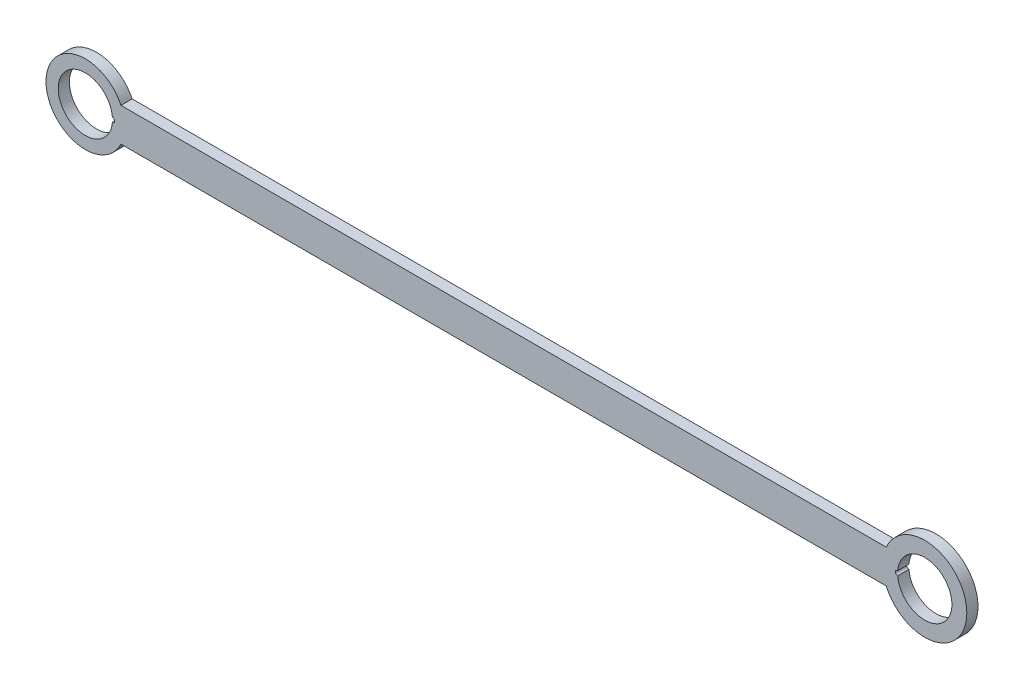
ISO-10303-21;
HEADER;
FILE_DESCRIPTION(('STEP AP214'),'2;1');
FILE_NAME('part.step','',(''),(''),'','','');
FILE_SCHEMA(('AUTOMOTIVE_DESIGN { 1 0 10303 214 1 1 1 1 }'));
ENDSEC;
DATA;
#1=APPLICATION_CONTEXT('core data for automotive mechanical design processes');
#2=APPLICATION_PROTOCOL_DEFINITION('international standard','automotive_design',2000,#1);
#3=PRODUCT_CONTEXT('',#1,'mechanical');
#4=PRODUCT('Part','Part','',(#3));
#5=PRODUCT_RELATED_PRODUCT_CATEGORY('part','',(#4));
#6=PRODUCT_DEFINITION_FORMATION('','',#4);
#7=PRODUCT_DEFINITION_CONTEXT('part definition',#1,'design');
#8=PRODUCT_DEFINITION('design','',#6,#7);
#9=PRODUCT_DEFINITION_SHAPE('','',#8);
#10=(LENGTH_UNIT() NAMED_UNIT(*) SI_UNIT(.MILLI.,.METRE.));
#11=(NAMED_UNIT(*) PLANE_ANGLE_UNIT() SI_UNIT($,.RADIAN.));
#12=(NAMED_UNIT(*) SI_UNIT($,.STERADIAN.) SOLID_ANGLE_UNIT());
#13=UNCERTAINTY_MEASURE_WITH_UNIT(LENGTH_MEASURE(1.E-05),#10,'distance_accuracy_value','');
#14=(GEOMETRIC_REPRESENTATION_CONTEXT(3) GLOBAL_UNCERTAINTY_ASSIGNED_CONTEXT((#13)) GLOBAL_UNIT_ASSIGNED_CONTEXT((#10,
#11,#12)) REPRESENTATION_CONTEXT('',''));
#15=CARTESIAN_POINT('',(0.,0.,0.));
#16=DIRECTION('',(0.,0.,1.));
#17=DIRECTION('',(1.,0.,0.));
#18=AXIS2_PLACEMENT_3D('',#15,#16,#17);
#19=CARTESIAN_POINT('',(0.,0.,4.));
#20=DIRECTION('',(0.,0.,-1.));
#21=DIRECTION('',(-1.,0.,0.));
#22=AXIS2_PLACEMENT_3D('',#19,#20,#21);
#23=PLANE('',#22);
#24=CARTESIAN_POINT('',(0.,0.,4.));
#25=DIRECTION('',(0.,0.,1.));
#26=DIRECTION('',(-1.,0.,0.));
#27=AXIS2_PLACEMENT_3D('',#24,#25,#26);
#28=CIRCLE('',#27,14.0628919691904);
#29=CARTESIAN_POINT('',(12.718684308415,6.,4.));
#30=VERTEX_POINT('',#29);
#31=CARTESIAN_POINT('',(12.718684308415,-6.,4.));
#32=VERTEX_POINT('',#31);
#33=EDGE_CURVE('E137',#30,#32,#28,.T.);
#34=ORIENTED_EDGE('',*,*,#33,.T.);
#35=DIRECTION('',(1.,0.,0.));
#36=VECTOR('',#35,1.);
#37=CARTESIAN_POINT('',(12.718684308415,-6.,4.));
#38=LINE('',#37,#36);
#39=CARTESIAN_POINT('',(286.224480752541,-5.99999999999999,4.));
#40=VERTEX_POINT('',#39);
#41=EDGE_CURVE('E141',#32,#40,#38,.T.);
#42=ORIENTED_EDGE('',*,*,#41,.T.);
#43=CARTESIAN_POINT('',(300.,0.,4.));
#44=DIRECTION('',(0.,0.,1.));
#45=DIRECTION('',(1.,0.,0.));
#46=AXIS2_PLACEMENT_3D('',#43,#44,#45);
#47=CIRCLE('',#46,15.0254760502661);
#48=CARTESIAN_POINT('',(286.224480752541,6.,4.));
#49=VERTEX_POINT('',#48);
#50=EDGE_CURVE('E145',#40,#49,#47,.T.);
#51=ORIENTED_EDGE('',*,*,#50,.T.);
#52=DIRECTION('',(-1.,0.,0.));
#53=VECTOR('',#52,1.);
#54=CARTESIAN_POINT('',(12.718684308415,6.,4.));
#55=LINE('',#54,#53);
#56=EDGE_CURVE('E148',#49,#30,#55,.T.);
#57=ORIENTED_EDGE('',*,*,#56,.T.);
#58=EDGE_LOOP('',(#34,#42,#51,#57));
#59=FACE_BOUND('',#58,.T.);
#60=CARTESIAN_POINT('',(0.,0.,4.));
#61=DIRECTION('',(0.,0.,1.));
#62=DIRECTION('',(1.,0.,0.));
#63=AXIS2_PLACEMENT_3D('',#60,#61,#62);
#64=CIRCLE('',#63,9.7);
#65=CARTESIAN_POINT('',(9.66701030927835,0.799319510775317,4.));
#66=VERTEX_POINT('',#65);
#67=CARTESIAN_POINT('',(9.66701030927835,-0.799319510775317,4.));
#68=VERTEX_POINT('',#67);
#69=EDGE_CURVE('E126',#66,#68,#64,.T.);
#70=ORIENTED_EDGE('',*,*,#69,.F.);
#71=CARTESIAN_POINT('',(9.7,0.,4.));
#72=DIRECTION('',(0.,0.,1.));
#73=DIRECTION('',(1.,0.,0.));
#74=AXIS2_PLACEMENT_3D('',#71,#72,#73);
#75=CIRCLE('',#74,0.800000000000001);
#76=EDGE_CURVE('E54',#68,#66,#75,.T.);
#77=ORIENTED_EDGE('',*,*,#76,.F.);
#78=EDGE_LOOP('',(#70,#77));
#79=FACE_BOUND('',#78,.T.);
#80=CARTESIAN_POINT('',(300.,0.,4.));
#81=DIRECTION('',(0.,0.,1.));
#82=DIRECTION('',(1.,0.,0.));
#83=AXIS2_PLACEMENT_3D('',#80,#81,#82);
#84=CIRCLE('',#83,9.7);
#85=CARTESIAN_POINT('',(290.332989690722,-0.799319510775326,4.));
#86=VERTEX_POINT('',#85);
#87=CARTESIAN_POINT('',(290.332989690722,0.799319510775327,4.));
#88=VERTEX_POINT('',#87);
#89=EDGE_CURVE('E115',#86,#88,#84,.T.);
#90=ORIENTED_EDGE('',*,*,#89,.F.);
#91=CARTESIAN_POINT('',(290.3,0.,4.));
#92=DIRECTION('',(0.,0.,1.));
#93=DIRECTION('',(1.,0.,0.));
#94=AXIS2_PLACEMENT_3D('',#91,#92,#93);
#95=CIRCLE('',#94,0.800000000000011);
#96=EDGE_CURVE('E62',#88,#86,#95,.T.);
#97=ORIENTED_EDGE('',*,*,#96,.F.);
#98=EDGE_LOOP('',(#90,#97));
#99=FACE_BOUND('',#98,.T.);
#100=ADVANCED_FACE('F39',(#59,#79,#99),#23,.F.);
#101=CARTESIAN_POINT('',(0.,0.,0.));
#102=DIRECTION('',(0.,0.,-1.));
#103=DIRECTION('',(-1.,0.,0.));
#104=AXIS2_PLACEMENT_3D('',#101,#102,#103);
#105=PLANE('',#104);
#106=CARTESIAN_POINT('',(9.7,0.,0.));
#107=DIRECTION('',(0.,0.,-1.));
#108=DIRECTION('',(-1.,0.,0.));
#109=AXIS2_PLACEMENT_3D('',#106,#107,#108);
#110=CIRCLE('',#109,0.800000000000001);
#111=CARTESIAN_POINT('',(9.66701030927835,0.799319510775316,0.));
#112=VERTEX_POINT('',#111);
#113=CARTESIAN_POINT('',(9.66701030927835,-0.79931951077531,0.));
#114=VERTEX_POINT('',#113);
#115=EDGE_CURVE('E128',#112,#114,#110,.T.);
#116=ORIENTED_EDGE('',*,*,#115,.F.);
#117=CARTESIAN_POINT('',(0.,0.,0.));
#118=DIRECTION('',(0.,0.,1.));
#119=DIRECTION('',(1.,0.,0.));
#120=AXIS2_PLACEMENT_3D('',#117,#118,#119);
#121=CIRCLE('',#120,9.7);
#122=EDGE_CURVE('E120',#112,#114,#121,.T.);
#123=ORIENTED_EDGE('',*,*,#122,.T.);
#124=EDGE_LOOP('',(#116,#123));
#125=FACE_BOUND('',#124,.T.);
#126=CARTESIAN_POINT('',(290.3,0.,0.));
#127=DIRECTION('',(0.,0.,-1.));
#128=DIRECTION('',(-1.,0.,0.));
#129=AXIS2_PLACEMENT_3D('',#126,#127,#128);
#130=CIRCLE('',#129,0.800000000000011);
#131=CARTESIAN_POINT('',(290.332989690722,-0.799319510775329,0.));
#132=VERTEX_POINT('',#131);
#133=CARTESIAN_POINT('',(290.332989690722,0.799319510775326,0.));
#134=VERTEX_POINT('',#133);
#135=EDGE_CURVE('E105',#132,#134,#130,.T.);
#136=ORIENTED_EDGE('',*,*,#135,.F.);
#137=CARTESIAN_POINT('',(300.,0.,0.));
#138=DIRECTION('',(0.,0.,1.));
#139=DIRECTION('',(1.,0.,0.));
#140=AXIS2_PLACEMENT_3D('',#137,#138,#139);
#141=CIRCLE('',#140,9.7);
#142=EDGE_CURVE('E121',#132,#134,#141,.T.);
#143=ORIENTED_EDGE('',*,*,#142,.T.);
#144=EDGE_LOOP('',(#136,#143));
#145=FACE_BOUND('',#144,.T.);
#146=CARTESIAN_POINT('',(0.,0.,0.));
#147=DIRECTION('',(0.,0.,1.));
#148=DIRECTION('',(-1.,0.,0.));
#149=AXIS2_PLACEMENT_3D('',#146,#147,#148);
#150=CIRCLE('',#149,14.0628919691904);
#151=CARTESIAN_POINT('',(12.718684308415,6.,0.));
#152=VERTEX_POINT('',#151);
#153=CARTESIAN_POINT('',(12.718684308415,-6.,0.));
#154=VERTEX_POINT('',#153);
#155=EDGE_CURVE('E135',#152,#154,#150,.T.);
#156=ORIENTED_EDGE('',*,*,#155,.F.);
#157=DIRECTION('',(-1.,0.,0.));
#158=VECTOR('',#157,1.);
#159=CARTESIAN_POINT('',(12.718684308415,6.,0.));
#160=LINE('',#159,#158);
#161=CARTESIAN_POINT('',(286.224480752541,6.,0.));
#162=VERTEX_POINT('',#161);
#163=EDGE_CURVE('E142',#162,#152,#160,.T.);
#164=ORIENTED_EDGE('',*,*,#163,.F.);
#165=CARTESIAN_POINT('',(300.,0.,0.));
#166=DIRECTION('',(0.,0.,1.));
#167=DIRECTION('',(1.,0.,0.));
#168=AXIS2_PLACEMENT_3D('',#165,#166,#167);
#169=CIRCLE('',#168,15.0254760502661);
#170=CARTESIAN_POINT('',(286.224480752541,-5.99999999999999,0.));
#171=VERTEX_POINT('',#170);
#172=EDGE_CURVE('E158',#171,#162,#169,.T.);
#173=ORIENTED_EDGE('',*,*,#172,.F.);
#174=DIRECTION('',(1.,0.,0.));
#175=VECTOR('',#174,1.);
#176=CARTESIAN_POINT('',(12.718684308415,-6.,0.));
#177=LINE('',#176,#175);
#178=EDGE_CURVE('E155',#154,#171,#177,.T.);
#179=ORIENTED_EDGE('',*,*,#178,.F.);
#180=EDGE_LOOP('',(#156,#164,#173,#179));
#181=FACE_BOUND('',#180,.T.);
#182=ADVANCED_FACE('F187',(#125,#145,#181),#105,.T.);
#183=CARTESIAN_POINT('',(0.,0.,4.));
#184=DIRECTION('',(0.,0.,-1.));
#185=DIRECTION('',(-1.,0.,0.));
#186=AXIS2_PLACEMENT_3D('',#183,#184,#185);
#187=CYLINDRICAL_SURFACE('',#186,14.0628919691904);
#188=ORIENTED_EDGE('',*,*,#155,.T.);
#189=DIRECTION('',(0.,0.,-1.));
#190=VECTOR('',#189,1.);
#191=CARTESIAN_POINT('',(12.718684308415,-6.,4.));
#192=LINE('',#191,#190);
#193=EDGE_CURVE('E174',#32,#154,#192,.T.);
#194=ORIENTED_EDGE('',*,*,#193,.F.);
#195=ORIENTED_EDGE('',*,*,#33,.F.);
#196=DIRECTION('',(0.,0.,-1.));
#197=VECTOR('',#196,1.);
#198=CARTESIAN_POINT('',(12.718684308415,6.,4.));
#199=LINE('',#198,#197);
#200=EDGE_CURVE('E151',#30,#152,#199,.T.);
#201=ORIENTED_EDGE('',*,*,#200,.T.);
#202=EDGE_LOOP('',(#188,#194,#195,#201));
#203=FACE_BOUND('',#202,.T.);
#204=ADVANCED_FACE('F41',(#203),#187,.T.);
#205=CARTESIAN_POINT('',(12.718684308415,-6.,4.));
#206=DIRECTION('',(0.,1.,0.));
#207=DIRECTION('',(0.,0.,1.));
#208=AXIS2_PLACEMENT_3D('',#205,#206,#207);
#209=PLANE('',#208);
#210=ORIENTED_EDGE('',*,*,#178,.T.);
#211=DIRECTION('',(0.,0.,-1.));
#212=VECTOR('',#211,1.);
#213=CARTESIAN_POINT('',(286.224480752541,-5.99999999999999,4.));
#214=LINE('',#213,#212);
#215=EDGE_CURVE('E170',#40,#171,#214,.T.);
#216=ORIENTED_EDGE('',*,*,#215,.F.);
#217=ORIENTED_EDGE('',*,*,#41,.F.);
#218=ORIENTED_EDGE('',*,*,#193,.T.);
#219=EDGE_LOOP('',(#210,#216,#217,#218));
#220=FACE_BOUND('',#219,.T.);
#221=ADVANCED_FACE('F211',(#220),#209,.F.);
#222=CARTESIAN_POINT('',(300.,0.,4.));
#223=DIRECTION('',(0.,0.,-1.));
#224=DIRECTION('',(-1.,0.,0.));
#225=AXIS2_PLACEMENT_3D('',#222,#223,#224);
#226=CYLINDRICAL_SURFACE('',#225,15.0254760502661);
#227=ORIENTED_EDGE('',*,*,#172,.T.);
#228=DIRECTION('',(0.,0.,-1.));
#229=VECTOR('',#228,1.);
#230=CARTESIAN_POINT('',(286.224480752541,6.,4.));
#231=LINE('',#230,#229);
#232=EDGE_CURVE('E166',#49,#162,#231,.T.);
#233=ORIENTED_EDGE('',*,*,#232,.F.);
#234=ORIENTED_EDGE('',*,*,#50,.F.);
#235=ORIENTED_EDGE('',*,*,#215,.T.);
#236=EDGE_LOOP('',(#227,#233,#234,#235));
#237=FACE_BOUND('',#236,.T.);
#238=ADVANCED_FACE('F208',(#237),#226,.T.);
#239=CARTESIAN_POINT('',(12.718684308415,6.,4.));
#240=DIRECTION('',(0.,-1.,0.));
#241=DIRECTION('',(0.,0.,-1.));
#242=AXIS2_PLACEMENT_3D('',#239,#240,#241);
#243=PLANE('',#242);
#244=ORIENTED_EDGE('',*,*,#163,.T.);
#245=ORIENTED_EDGE('',*,*,#200,.F.);
#246=ORIENTED_EDGE('',*,*,#56,.F.);
#247=ORIENTED_EDGE('',*,*,#232,.T.);
#248=EDGE_LOOP('',(#244,#245,#246,#247));
#249=FACE_BOUND('',#248,.T.);
#250=ADVANCED_FACE('F205',(#249),#243,.F.);
#251=CARTESIAN_POINT('',(0.,0.,4.));
#252=DIRECTION('',(0.,0.,-1.));
#253=DIRECTION('',(-1.,0.,0.));
#254=AXIS2_PLACEMENT_3D('',#251,#252,#253);
#255=CYLINDRICAL_SURFACE('',#254,9.7);
#256=DIRECTION('',(0.,0.,1.));
#257=VECTOR('',#256,1.);
#258=CARTESIAN_POINT('',(9.66701030927835,-0.799319510775316,-1.));
#259=LINE('',#258,#257);
#260=EDGE_CURVE('E11',#114,#68,#259,.T.);
#261=ORIENTED_EDGE('',*,*,#260,.F.);
#262=ORIENTED_EDGE('',*,*,#122,.F.);
#263=DIRECTION('',(0.,0.,1.));
#264=VECTOR('',#263,1.);
#265=CARTESIAN_POINT('',(9.66701030927835,0.799319510775316,-1.));
#266=LINE('',#265,#264);
#267=EDGE_CURVE('E48',#66,#112,#266,.F.);
#268=ORIENTED_EDGE('',*,*,#267,.F.);
#269=ORIENTED_EDGE('',*,*,#69,.T.);
#270=EDGE_LOOP('',(#261,#262,#268,#269));
#271=FACE_BOUND('',#270,.T.);
#272=ADVANCED_FACE('F190',(#271),#255,.F.);
#273=CARTESIAN_POINT('',(300.,0.,4.));
#274=DIRECTION('',(0.,0.,-1.));
#275=DIRECTION('',(-1.,0.,0.));
#276=AXIS2_PLACEMENT_3D('',#273,#274,#275);
#277=CYLINDRICAL_SURFACE('',#276,9.7);
#278=DIRECTION('',(0.,0.,1.));
#279=VECTOR('',#278,1.);
#280=CARTESIAN_POINT('',(290.332989690722,0.799319510775327,-1.));
#281=LINE('',#280,#279);
#282=EDGE_CURVE('E102',#134,#88,#281,.T.);
#283=ORIENTED_EDGE('',*,*,#282,.F.);
#284=ORIENTED_EDGE('',*,*,#142,.F.);
#285=DIRECTION('',(0.,0.,1.));
#286=VECTOR('',#285,1.);
#287=CARTESIAN_POINT('',(290.332989690722,-0.799319510775327,-1.));
#288=LINE('',#287,#286);
#289=EDGE_CURVE('E111',#86,#132,#288,.F.);
#290=ORIENTED_EDGE('',*,*,#289,.F.);
#291=ORIENTED_EDGE('',*,*,#89,.T.);
#292=EDGE_LOOP('',(#283,#284,#290,#291));
#293=FACE_BOUND('',#292,.T.);
#294=ADVANCED_FACE('F118',(#293),#277,.F.);
#295=CARTESIAN_POINT('',(290.3,0.,-6.));
#296=DIRECTION('',(0.,0.,1.));
#297=DIRECTION('',(1.,0.,0.));
#298=AXIS2_PLACEMENT_3D('',#295,#296,#297);
#299=CYLINDRICAL_SURFACE('',#298,0.800000000000011);
#300=ORIENTED_EDGE('',*,*,#282,.T.);
#301=ORIENTED_EDGE('',*,*,#96,.T.);
#302=ORIENTED_EDGE('',*,*,#289,.T.);
#303=ORIENTED_EDGE('',*,*,#135,.T.);
#304=EDGE_LOOP('',(#300,#301,#302,#303));
#305=FACE_BOUND('',#304,.T.);
#306=ADVANCED_FACE('F103',(#305),#299,.F.);
#307=CARTESIAN_POINT('',(9.7,0.,-6.));
#308=DIRECTION('',(0.,0.,1.));
#309=DIRECTION('',(1.,0.,0.));
#310=AXIS2_PLACEMENT_3D('',#307,#308,#309);
#311=CYLINDRICAL_SURFACE('',#310,0.800000000000001);
#312=ORIENTED_EDGE('',*,*,#260,.T.);
#313=ORIENTED_EDGE('',*,*,#76,.T.);
#314=ORIENTED_EDGE('',*,*,#267,.T.);
#315=ORIENTED_EDGE('',*,*,#115,.T.);
#316=EDGE_LOOP('',(#312,#313,#314,#315));
#317=FACE_BOUND('',#316,.T.);
#318=ADVANCED_FACE('F181',(#317),#311,.F.);
#319=CLOSED_SHELL('',(#100,#182,#204,#221,#238,#250,#272,#294,#306,#318));
#320=MANIFOLD_SOLID_BREP('B2',#319);
#321=ADVANCED_BREP_SHAPE_REPRESENTATION('',(#18,#320),#14);
#322=SHAPE_DEFINITION_REPRESENTATION(#9,#321);
ENDSEC;
END-ISO-10303-21;
